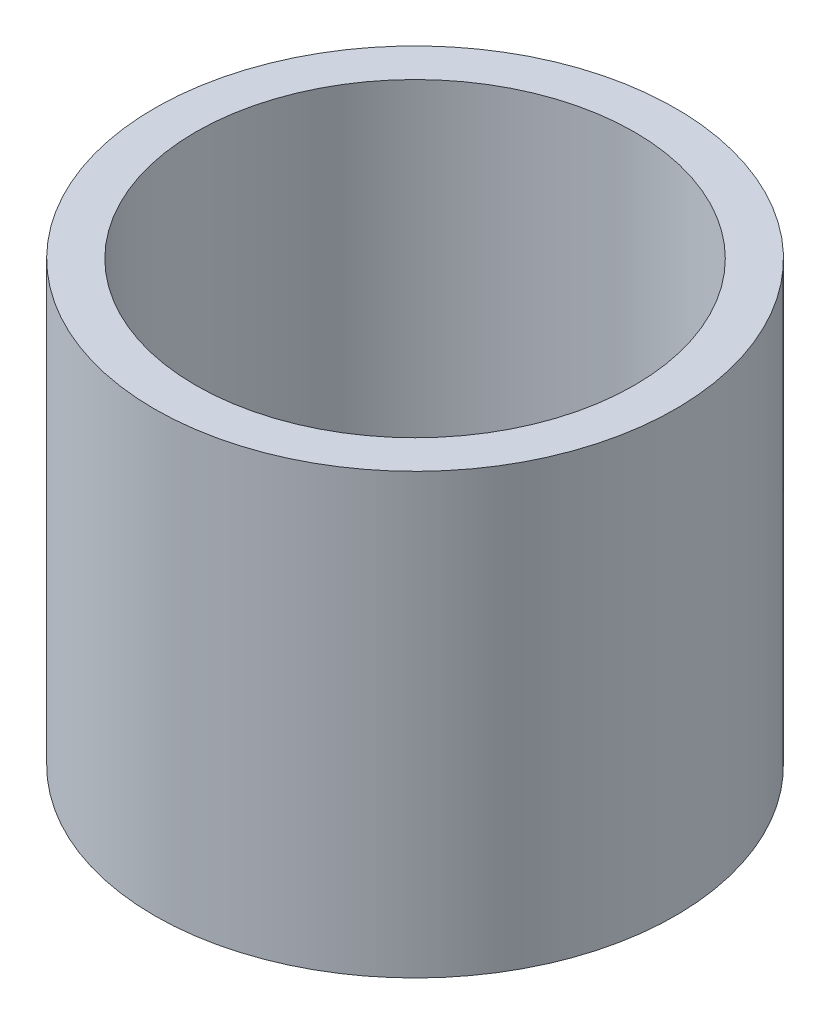
ISO-10303-21;
HEADER;
FILE_DESCRIPTION(('STEP AP214'),'2;1');
FILE_NAME('part.step','',(''),(''),'','','');
FILE_SCHEMA(('AUTOMOTIVE_DESIGN { 1 0 10303 214 1 1 1 1 }'));
ENDSEC;
DATA;
#1=APPLICATION_CONTEXT('core data for automotive mechanical design processes');
#2=APPLICATION_PROTOCOL_DEFINITION('international standard','automotive_design',2000,#1);
#3=PRODUCT_CONTEXT('',#1,'mechanical');
#4=PRODUCT('Part','Part','',(#3));
#5=PRODUCT_RELATED_PRODUCT_CATEGORY('part','',(#4));
#6=PRODUCT_DEFINITION_FORMATION('','',#4);
#7=PRODUCT_DEFINITION_CONTEXT('part definition',#1,'design');
#8=PRODUCT_DEFINITION('design','',#6,#7);
#9=PRODUCT_DEFINITION_SHAPE('','',#8);
#10=(LENGTH_UNIT() NAMED_UNIT(*) SI_UNIT(.MILLI.,.METRE.));
#11=(NAMED_UNIT(*) PLANE_ANGLE_UNIT() SI_UNIT($,.RADIAN.));
#12=(NAMED_UNIT(*) SI_UNIT($,.STERADIAN.) SOLID_ANGLE_UNIT());
#13=UNCERTAINTY_MEASURE_WITH_UNIT(LENGTH_MEASURE(1.E-05),#10,'distance_accuracy_value','');
#14=(GEOMETRIC_REPRESENTATION_CONTEXT(3) GLOBAL_UNCERTAINTY_ASSIGNED_CONTEXT((#13)) GLOBAL_UNIT_ASSIGNED_CONTEXT((#10,
#11,#12)) REPRESENTATION_CONTEXT('',''));
#15=CARTESIAN_POINT('',(0.,0.,0.));
#16=DIRECTION('',(0.,0.,1.));
#17=DIRECTION('',(1.,0.,0.));
#18=AXIS2_PLACEMENT_3D('',#15,#16,#17);
#19=CARTESIAN_POINT('',(0.,12.7,0.));
#20=DIRECTION('',(0.,1.,0.));
#21=DIRECTION('',(0.,0.,1.));
#22=AXIS2_PLACEMENT_3D('',#19,#20,#21);
#23=PLANE('',#22);
#24=CARTESIAN_POINT('',(0.,12.7,0.));
#25=DIRECTION('',(0.,1.,0.));
#26=DIRECTION('',(0.,0.,1.));
#27=AXIS2_PLACEMENT_3D('',#24,#25,#26);
#28=CIRCLE('',#27,7.540625);
#29=CARTESIAN_POINT('',(0.,12.7,7.540625));
#30=VERTEX_POINT('',#29);
#31=EDGE_CURVE('E10',#30,#30,#28,.T.);
#32=ORIENTED_EDGE('',*,*,#31,.T.);
#33=EDGE_LOOP('',(#32));
#34=FACE_BOUND('',#33,.T.);
#35=CARTESIAN_POINT('',(0.,12.7,0.));
#36=DIRECTION('',(0.,1.,0.));
#37=DIRECTION('',(0.,0.,1.));
#38=AXIS2_PLACEMENT_3D('',#35,#36,#37);
#39=CIRCLE('',#38,6.35);
#40=CARTESIAN_POINT('',(0.,12.7,6.35));
#41=VERTEX_POINT('',#40);
#42=EDGE_CURVE('E57',#41,#41,#39,.T.);
#43=ORIENTED_EDGE('',*,*,#42,.F.);
#44=EDGE_LOOP('',(#43));
#45=FACE_BOUND('',#44,.T.);
#46=ADVANCED_FACE('F43',(#34,#45),#23,.T.);
#47=CARTESIAN_POINT('',(0.,0.,0.));
#48=DIRECTION('',(0.,1.,0.));
#49=DIRECTION('',(0.,0.,1.));
#50=AXIS2_PLACEMENT_3D('',#47,#48,#49);
#51=PLANE('',#50);
#52=CARTESIAN_POINT('',(0.,0.,0.));
#53=DIRECTION('',(0.,1.,0.));
#54=DIRECTION('',(0.,0.,1.));
#55=AXIS2_PLACEMENT_3D('',#52,#53,#54);
#56=CIRCLE('',#55,7.540625);
#57=CARTESIAN_POINT('',(0.,0.,7.540625));
#58=VERTEX_POINT('',#57);
#59=EDGE_CURVE('E50',#58,#58,#56,.T.);
#60=ORIENTED_EDGE('',*,*,#59,.F.);
#61=EDGE_LOOP('',(#60));
#62=FACE_BOUND('',#61,.T.);
#63=CARTESIAN_POINT('',(0.,0.,0.));
#64=DIRECTION('',(0.,1.,0.));
#65=DIRECTION('',(0.,0.,1.));
#66=AXIS2_PLACEMENT_3D('',#63,#64,#65);
#67=CIRCLE('',#66,6.35);
#68=CARTESIAN_POINT('',(0.,0.,6.35));
#69=VERTEX_POINT('',#68);
#70=EDGE_CURVE('E59',#69,#69,#67,.T.);
#71=ORIENTED_EDGE('',*,*,#70,.T.);
#72=EDGE_LOOP('',(#71));
#73=FACE_BOUND('',#72,.T.);
#74=ADVANCED_FACE('F68',(#62,#73),#51,.F.);
#75=CARTESIAN_POINT('',(0.,12.7,0.));
#76=DIRECTION('',(0.,-1.,0.));
#77=DIRECTION('',(0.,0.,-1.));
#78=AXIS2_PLACEMENT_3D('',#75,#76,#77);
#79=CYLINDRICAL_SURFACE('',#78,7.540625);
#80=ORIENTED_EDGE('',*,*,#31,.F.);
#81=EDGE_LOOP('',(#80));
#82=FACE_BOUND('',#81,.T.);
#83=ORIENTED_EDGE('',*,*,#59,.T.);
#84=EDGE_LOOP('',(#83));
#85=FACE_BOUND('',#84,.T.);
#86=ADVANCED_FACE('F44',(#82,#85),#79,.T.);
#87=CARTESIAN_POINT('',(0.,12.7,0.));
#88=DIRECTION('',(0.,-1.,0.));
#89=DIRECTION('',(0.,0.,-1.));
#90=AXIS2_PLACEMENT_3D('',#87,#88,#89);
#91=CYLINDRICAL_SURFACE('',#90,6.35);
#92=ORIENTED_EDGE('',*,*,#42,.T.);
#93=EDGE_LOOP('',(#92));
#94=FACE_BOUND('',#93,.T.);
#95=ORIENTED_EDGE('',*,*,#70,.F.);
#96=EDGE_LOOP('',(#95));
#97=FACE_BOUND('',#96,.T.);
#98=ADVANCED_FACE('F67',(#94,#97),#91,.F.);
#99=CLOSED_SHELL('',(#46,#74,#86,#98));
#100=MANIFOLD_SOLID_BREP('B2',#99);
#101=ADVANCED_BREP_SHAPE_REPRESENTATION('',(#18,#100),#14);
#102=SHAPE_DEFINITION_REPRESENTATION(#9,#101);
ENDSEC;
END-ISO-10303-21;
